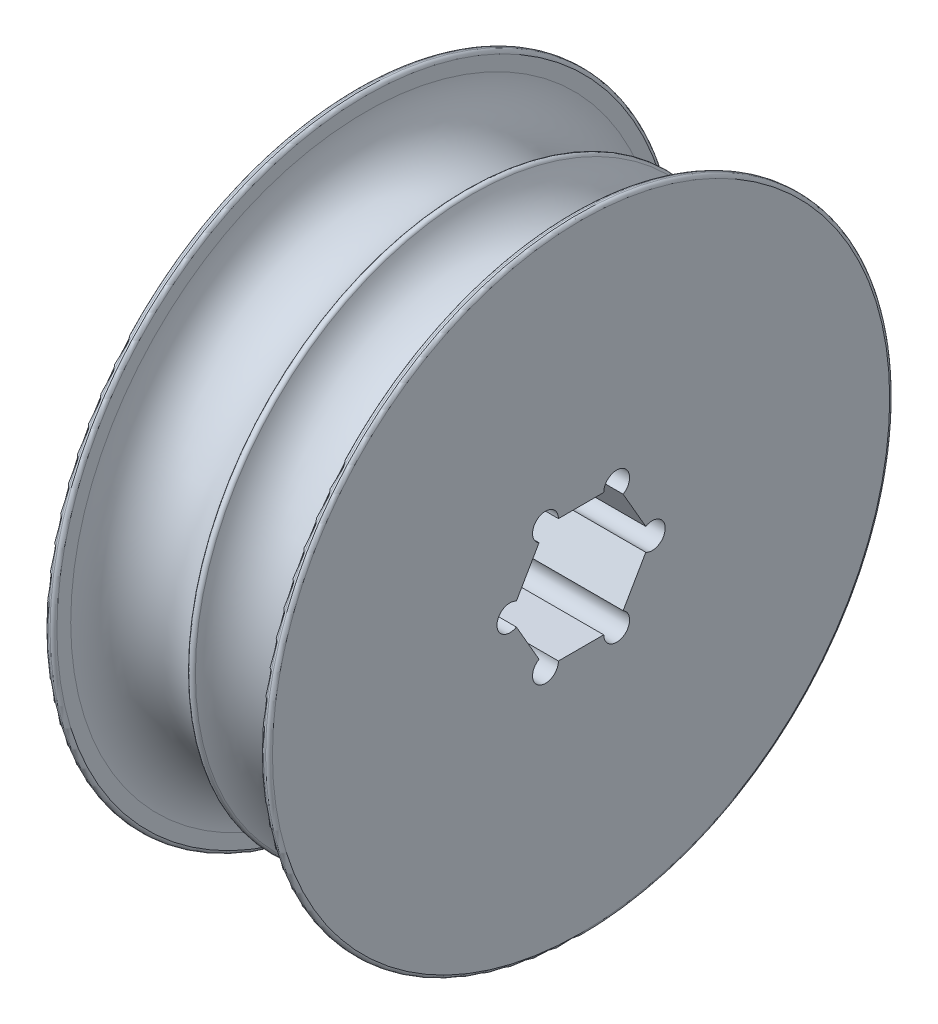
ISO-10303-21;
HEADER;
FILE_DESCRIPTION(('STEP AP214'),'2;1');
FILE_NAME('part.step','',(''),(''),'','','');
FILE_SCHEMA(('AUTOMOTIVE_DESIGN { 1 0 10303 214 1 1 1 1 }'));
ENDSEC;
DATA;
#1=APPLICATION_CONTEXT('core data for automotive mechanical design processes');
#2=APPLICATION_PROTOCOL_DEFINITION('international standard','automotive_design',2000,#1);
#3=PRODUCT_CONTEXT('',#1,'mechanical');
#4=PRODUCT('Part','Part','',(#3));
#5=PRODUCT_RELATED_PRODUCT_CATEGORY('part','',(#4));
#6=PRODUCT_DEFINITION_FORMATION('','',#4);
#7=PRODUCT_DEFINITION_CONTEXT('part definition',#1,'design');
#8=PRODUCT_DEFINITION('design','',#6,#7);
#9=PRODUCT_DEFINITION_SHAPE('','',#8);
#10=(LENGTH_UNIT() NAMED_UNIT(*) SI_UNIT(.MILLI.,.METRE.));
#11=(NAMED_UNIT(*) PLANE_ANGLE_UNIT() SI_UNIT($,.RADIAN.));
#12=(NAMED_UNIT(*) SI_UNIT($,.STERADIAN.) SOLID_ANGLE_UNIT());
#13=UNCERTAINTY_MEASURE_WITH_UNIT(LENGTH_MEASURE(1.E-05),#10,'distance_accuracy_value','');
#14=(GEOMETRIC_REPRESENTATION_CONTEXT(3) GLOBAL_UNCERTAINTY_ASSIGNED_CONTEXT((#13)) GLOBAL_UNIT_ASSIGNED_CONTEXT((#10,
#11,#12)) REPRESENTATION_CONTEXT('',''));
#15=CARTESIAN_POINT('',(0.,0.,0.));
#16=DIRECTION('',(0.,0.,1.));
#17=DIRECTION('',(1.,0.,0.));
#18=AXIS2_PLACEMENT_3D('',#15,#16,#17);
#19=CARTESIAN_POINT('',(0.,0.,0.));
#20=DIRECTION('',(-1.,0.,0.));
#21=DIRECTION('',(0.,0.,1.));
#22=AXIS2_PLACEMENT_3D('',#19,#20,#21);
#23=PLANE('',#22);
#24=CARTESIAN_POINT('',(0.,0.,0.));
#25=DIRECTION('',(-1.,0.,0.));
#26=DIRECTION('',(0.,0.,1.));
#27=AXIS2_PLACEMENT_3D('',#24,#25,#26);
#28=CIRCLE('',#27,17.9);
#29=CARTESIAN_POINT('',(0.,0.,17.9));
#30=VERTEX_POINT('',#29);
#31=EDGE_CURVE('E162',#30,#30,#28,.F.);
#32=ORIENTED_EDGE('',*,*,#31,.T.);
#33=EDGE_LOOP('',(#32));
#34=FACE_BOUND('',#33,.T.);
#35=DIRECTION('',(0.,-0.866025403784438,-0.500000000000001));
#36=VECTOR('',#35,1.);
#37=CARTESIAN_POINT('',(0.,-0.649519052838328,3.75305442470583));
#38=LINE('',#37,#36);
#39=CARTESIAN_POINT('',(0.,-2.92548094716167,2.43902721235291));
#40=VERTEX_POINT('',#39);
#41=CARTESIAN_POINT('',(0.,-0.649519052838329,3.75305442470583));
#42=VERTEX_POINT('',#41);
#43=EDGE_CURVE('E223',#40,#42,#38,.F.);
#44=ORIENTED_EDGE('',*,*,#43,.T.);
#45=CARTESIAN_POINT('',(0.,0.,4.12805442470582));
#46=DIRECTION('',(1.,0.,0.));
#47=DIRECTION('',(0.,0.,-1.));
#48=AXIS2_PLACEMENT_3D('',#45,#46,#47);
#49=CIRCLE('',#48,0.75);
#50=CARTESIAN_POINT('',(0.,0.64951905283833,3.75305442470582));
#51=VERTEX_POINT('',#50);
#52=EDGE_CURVE('E137',#51,#42,#49,.T.);
#53=ORIENTED_EDGE('',*,*,#52,.F.);
#54=DIRECTION('',(0.,-0.866025403784439,0.5));
#55=VECTOR('',#54,1.);
#56=CARTESIAN_POINT('',(0.,2.92548094716167,2.43902721235291));
#57=LINE('',#56,#55);
#58=CARTESIAN_POINT('',(0.,2.92548094716167,2.43902721235291));
#59=VERTEX_POINT('',#58);
#60=EDGE_CURVE('E122',#51,#59,#57,.F.);
#61=ORIENTED_EDGE('',*,*,#60,.T.);
#62=CARTESIAN_POINT('',(0.,3.575,2.06402721235291));
#63=DIRECTION('',(1.,0.,0.));
#64=DIRECTION('',(0.,0.,-1.));
#65=AXIS2_PLACEMENT_3D('',#62,#63,#64);
#66=CIRCLE('',#65,0.75);
#67=CARTESIAN_POINT('',(0.,3.575,1.31402721235291));
#68=VERTEX_POINT('',#67);
#69=EDGE_CURVE('E109',#68,#59,#66,.T.);
#70=ORIENTED_EDGE('',*,*,#69,.F.);
#71=DIRECTION('',(0.,0.,1.));
#72=VECTOR('',#71,1.);
#73=CARTESIAN_POINT('',(0.,3.575,0.));
#74=LINE('',#73,#72);
#75=CARTESIAN_POINT('',(0.,3.575,-1.31402721235292));
#76=VERTEX_POINT('',#75);
#77=EDGE_CURVE('E123',#68,#76,#74,.F.);
#78=ORIENTED_EDGE('',*,*,#77,.T.);
#79=CARTESIAN_POINT('',(0.,3.575,-2.06402721235292));
#80=DIRECTION('',(1.,0.,0.));
#81=DIRECTION('',(0.,0.,-1.));
#82=AXIS2_PLACEMENT_3D('',#79,#80,#81);
#83=CIRCLE('',#82,0.75);
#84=CARTESIAN_POINT('',(0.,2.92548094716167,-2.43902721235291));
#85=VERTEX_POINT('',#84);
#86=EDGE_CURVE('E286',#85,#76,#83,.T.);
#87=ORIENTED_EDGE('',*,*,#86,.F.);
#88=DIRECTION('',(0.,0.866025403784438,0.500000000000001));
#89=VECTOR('',#88,1.);
#90=CARTESIAN_POINT('',(0.,0.649519052838327,-3.75305442470583));
#91=LINE('',#90,#89);
#92=CARTESIAN_POINT('',(0.,0.649519052838327,-3.75305442470583));
#93=VERTEX_POINT('',#92);
#94=EDGE_CURVE('E282',#85,#93,#91,.F.);
#95=ORIENTED_EDGE('',*,*,#94,.T.);
#96=CARTESIAN_POINT('',(0.,0.,-4.12805442470583));
#97=DIRECTION('',(1.,0.,0.));
#98=DIRECTION('',(0.,0.,-1.));
#99=AXIS2_PLACEMENT_3D('',#96,#97,#98);
#100=CIRCLE('',#99,0.75);
#101=CARTESIAN_POINT('',(0.,-0.649519052838329,-3.75305442470582));
#102=VERTEX_POINT('',#101);
#103=EDGE_CURVE('E279',#102,#93,#100,.T.);
#104=ORIENTED_EDGE('',*,*,#103,.F.);
#105=DIRECTION('',(0.,0.866025403784439,-0.5));
#106=VECTOR('',#105,1.);
#107=CARTESIAN_POINT('',(0.,-2.92548094716167,-2.43902721235291));
#108=LINE('',#107,#106);
#109=CARTESIAN_POINT('',(0.,-2.92548094716167,-2.43902721235291));
#110=VERTEX_POINT('',#109);
#111=EDGE_CURVE('E275',#102,#110,#108,.F.);
#112=ORIENTED_EDGE('',*,*,#111,.T.);
#113=CARTESIAN_POINT('',(0.,-3.575,-2.06402721235291));
#114=DIRECTION('',(1.,0.,0.));
#115=DIRECTION('',(0.,0.,-1.));
#116=AXIS2_PLACEMENT_3D('',#113,#114,#115);
#117=CIRCLE('',#116,0.75);
#118=CARTESIAN_POINT('',(0.,-3.575,-1.31402721235291));
#119=VERTEX_POINT('',#118);
#120=EDGE_CURVE('E272',#119,#110,#117,.T.);
#121=ORIENTED_EDGE('',*,*,#120,.F.);
#122=DIRECTION('',(0.,0.,1.));
#123=VECTOR('',#122,1.);
#124=CARTESIAN_POINT('',(0.,-3.575,0.));
#125=LINE('',#124,#123);
#126=CARTESIAN_POINT('',(0.,-3.575,1.31402721235291));
#127=VERTEX_POINT('',#126);
#128=EDGE_CURVE('E268',#119,#127,#125,.T.);
#129=ORIENTED_EDGE('',*,*,#128,.T.);
#130=CARTESIAN_POINT('',(0.,-3.575,2.06402721235292));
#131=DIRECTION('',(1.,0.,0.));
#132=DIRECTION('',(0.,0.,-1.));
#133=AXIS2_PLACEMENT_3D('',#130,#131,#132);
#134=CIRCLE('',#133,0.75);
#135=EDGE_CURVE('E265',#40,#127,#134,.T.);
#136=ORIENTED_EDGE('',*,*,#135,.F.);
#137=EDGE_LOOP('',(#44,#53,#61,#70,#78,#87,#95,#104,#112,#121,#129,#136));
#138=FACE_BOUND('',#137,.T.);
#139=ADVANCED_FACE('F45',(#34,#138),#23,.F.);
#140=CARTESIAN_POINT('',(-13.,0.,0.));
#141=DIRECTION('',(-1.,0.,0.));
#142=DIRECTION('',(0.,0.,1.));
#143=AXIS2_PLACEMENT_3D('',#140,#141,#142);
#144=CYLINDRICAL_SURFACE('',#143,18.1);
#145=CARTESIAN_POINT('',(-0.200000000000004,0.,0.));
#146=DIRECTION('',(-1.,0.,0.));
#147=DIRECTION('',(0.,0.,1.));
#148=AXIS2_PLACEMENT_3D('',#145,#146,#147);
#149=CIRCLE('',#148,18.1);
#150=CARTESIAN_POINT('',(-0.200000000000002,0.,18.1));
#151=VERTEX_POINT('',#150);
#152=EDGE_CURVE('E158',#151,#151,#149,.T.);
#153=ORIENTED_EDGE('',*,*,#152,.T.);
#154=EDGE_LOOP('',(#153));
#155=FACE_BOUND('',#154,.T.);
#156=CARTESIAN_POINT('',(-0.300000000000003,0.,0.));
#157=DIRECTION('',(1.,0.,0.));
#158=DIRECTION('',(0.,0.,-1.));
#159=AXIS2_PLACEMENT_3D('',#156,#157,#158);
#160=CIRCLE('',#159,18.1);
#161=CARTESIAN_POINT('',(-0.300000000000006,0.,-18.1));
#162=VERTEX_POINT('',#161);
#163=EDGE_CURVE('E154',#162,#162,#160,.T.);
#164=ORIENTED_EDGE('',*,*,#163,.T.);
#165=EDGE_LOOP('',(#164));
#166=FACE_BOUND('',#165,.T.);
#167=ADVANCED_FACE('F380',(#155,#166),#144,.T.);
#168=CARTESIAN_POINT('',(-0.500000000000004,0.,-18.1));
#169=DIRECTION('',(1.,0.,0.));
#170=DIRECTION('',(0.,0.,-1.));
#171=AXIS2_PLACEMENT_3D('',#168,#169,#170);
#172=PLANE('',#171);
#173=CARTESIAN_POINT('',(-0.500000000000002,0.,0.));
#174=DIRECTION('',(1.,0.,0.));
#175=DIRECTION('',(0.,0.,-1.));
#176=AXIS2_PLACEMENT_3D('',#173,#174,#175);
#177=CIRCLE('',#176,17.9);
#178=CARTESIAN_POINT('',(-0.500000000000004,0.,-17.9));
#179=VERTEX_POINT('',#178);
#180=EDGE_CURVE('E166',#179,#179,#177,.F.);
#181=ORIENTED_EDGE('',*,*,#180,.T.);
#182=EDGE_LOOP('',(#181));
#183=FACE_BOUND('',#182,.T.);
#184=CARTESIAN_POINT('',(-0.500000000000002,0.,0.));
#185=DIRECTION('',(-1.,0.,0.));
#186=DIRECTION('',(0.,0.,1.));
#187=AXIS2_PLACEMENT_3D('',#184,#185,#186);
#188=CIRCLE('',#187,17.1);
#189=CARTESIAN_POINT('',(-0.5,0.,17.1));
#190=VERTEX_POINT('',#189);
#191=EDGE_CURVE('E150',#190,#190,#188,.T.);
#192=ORIENTED_EDGE('',*,*,#191,.F.);
#193=EDGE_LOOP('',(#192));
#194=FACE_BOUND('',#193,.T.);
#195=ADVANCED_FACE('F387',(#183,#194),#172,.F.);
#196=CARTESIAN_POINT('',(-3.5,0.,0.));
#197=DIRECTION('',(-1.,0.,0.));
#198=DIRECTION('',(0.,0.,1.));
#199=AXIS2_PLACEMENT_3D('',#196,#197,#198);
#200=TOROIDAL_SURFACE('',#199,17.1,3.);
#201=CARTESIAN_POINT('',(-6.31250000000001,0.,0.));
#202=DIRECTION('',(1.,0.,0.));
#203=DIRECTION('',(0.,0.,-1.));
#204=AXIS2_PLACEMENT_3D('',#201,#202,#203);
#205=CIRCLE('',#204,16.0560441819694);
#206=CARTESIAN_POINT('',(-6.31250000000001,0.,-16.0560441819694));
#207=VERTEX_POINT('',#206);
#208=EDGE_CURVE('E149',#207,#207,#205,.T.);
#209=ORIENTED_EDGE('',*,*,#208,.T.);
#210=EDGE_LOOP('',(#209));
#211=FACE_BOUND('',#210,.T.);
#212=ORIENTED_EDGE('',*,*,#191,.T.);
#213=EDGE_LOOP('',(#212));
#214=FACE_BOUND('',#213,.T.);
#215=ADVANCED_FACE('F410',(#211,#214),#200,.F.);
#216=CARTESIAN_POINT('',(-9.5,0.,0.));
#217=DIRECTION('',(-1.,0.,0.));
#218=DIRECTION('',(0.,0.,1.));
#219=AXIS2_PLACEMENT_3D('',#216,#217,#218);
#220=TOROIDAL_SURFACE('',#219,17.1,3.);
#221=CARTESIAN_POINT('',(-6.68750000000012,0.,0.));
#222=DIRECTION('',(-1.,0.,0.));
#223=DIRECTION('',(0.,0.,1.));
#224=AXIS2_PLACEMENT_3D('',#221,#222,#223);
#225=CIRCLE('',#224,16.0560441819694);
#226=CARTESIAN_POINT('',(-6.68750000000012,0.,16.0560441819694));
#227=VERTEX_POINT('',#226);
#228=EDGE_CURVE('E145',#227,#227,#225,.T.);
#229=ORIENTED_EDGE('',*,*,#228,.T.);
#230=EDGE_LOOP('',(#229));
#231=FACE_BOUND('',#230,.T.);
#232=CARTESIAN_POINT('',(-12.5,0.,0.));
#233=DIRECTION('',(-1.,0.,0.));
#234=DIRECTION('',(0.,0.,1.));
#235=AXIS2_PLACEMENT_3D('',#232,#233,#234);
#236=CIRCLE('',#235,17.1);
#237=CARTESIAN_POINT('',(-12.5,0.,17.1));
#238=VERTEX_POINT('',#237);
#239=EDGE_CURVE('E141',#238,#238,#236,.T.);
#240=ORIENTED_EDGE('',*,*,#239,.F.);
#241=EDGE_LOOP('',(#240));
#242=FACE_BOUND('',#241,.T.);
#243=ADVANCED_FACE('F414',(#231,#242),#220,.F.);
#244=CARTESIAN_POINT('',(-12.5,0.,-18.1));
#245=DIRECTION('',(-1.,0.,0.));
#246=DIRECTION('',(0.,0.,1.));
#247=AXIS2_PLACEMENT_3D('',#244,#245,#246);
#248=PLANE('',#247);
#249=CARTESIAN_POINT('',(-12.5,0.,0.));
#250=DIRECTION('',(-1.,0.,0.));
#251=DIRECTION('',(0.,0.,1.));
#252=AXIS2_PLACEMENT_3D('',#249,#250,#251);
#253=CIRCLE('',#252,17.9);
#254=CARTESIAN_POINT('',(-12.5,0.,17.9));
#255=VERTEX_POINT('',#254);
#256=EDGE_CURVE('E54',#255,#255,#253,.F.);
#257=ORIENTED_EDGE('',*,*,#256,.T.);
#258=EDGE_LOOP('',(#257));
#259=FACE_BOUND('',#258,.T.);
#260=ORIENTED_EDGE('',*,*,#239,.T.);
#261=EDGE_LOOP('',(#260));
#262=FACE_BOUND('',#261,.T.);
#263=ADVANCED_FACE('F181',(#259,#262),#248,.F.);
#264=CARTESIAN_POINT('',(-13.,0.,0.));
#265=DIRECTION('',(-1.,0.,0.));
#266=DIRECTION('',(0.,0.,1.));
#267=AXIS2_PLACEMENT_3D('',#264,#265,#266);
#268=CYLINDRICAL_SURFACE('',#267,18.1);
#269=CARTESIAN_POINT('',(-12.7,0.,0.));
#270=DIRECTION('',(-1.,0.,0.));
#271=DIRECTION('',(0.,0.,1.));
#272=AXIS2_PLACEMENT_3D('',#269,#270,#271);
#273=CIRCLE('',#272,18.1);
#274=CARTESIAN_POINT('',(-12.7,0.,18.1));
#275=VERTEX_POINT('',#274);
#276=EDGE_CURVE('E174',#275,#275,#273,.T.);
#277=ORIENTED_EDGE('',*,*,#276,.T.);
#278=EDGE_LOOP('',(#277));
#279=FACE_BOUND('',#278,.T.);
#280=CARTESIAN_POINT('',(-12.8,0.,0.));
#281=DIRECTION('',(1.,0.,0.));
#282=DIRECTION('',(0.,0.,-1.));
#283=AXIS2_PLACEMENT_3D('',#280,#281,#282);
#284=CIRCLE('',#283,18.1);
#285=CARTESIAN_POINT('',(-12.8,0.,-18.1));
#286=VERTEX_POINT('',#285);
#287=EDGE_CURVE('E170',#286,#286,#284,.T.);
#288=ORIENTED_EDGE('',*,*,#287,.T.);
#289=EDGE_LOOP('',(#288));
#290=FACE_BOUND('',#289,.T.);
#291=ADVANCED_FACE('F190',(#279,#290),#268,.T.);
#292=CARTESIAN_POINT('',(-13.,0.,0.));
#293=DIRECTION('',(1.,0.,0.));
#294=DIRECTION('',(0.,0.,-1.));
#295=AXIS2_PLACEMENT_3D('',#292,#293,#294);
#296=PLANE('',#295);
#297=CARTESIAN_POINT('',(-13.,0.,0.));
#298=DIRECTION('',(1.,0.,0.));
#299=DIRECTION('',(0.,0.,-1.));
#300=AXIS2_PLACEMENT_3D('',#297,#298,#299);
#301=CIRCLE('',#300,17.9);
#302=CARTESIAN_POINT('',(-13.,0.,-17.9));
#303=VERTEX_POINT('',#302);
#304=EDGE_CURVE('E11',#303,#303,#301,.F.);
#305=ORIENTED_EDGE('',*,*,#304,.T.);
#306=EDGE_LOOP('',(#305));
#307=FACE_BOUND('',#306,.T.);
#308=DIRECTION('',(0.,0.866025403784439,-0.5));
#309=VECTOR('',#308,1.);
#310=CARTESIAN_POINT('',(-13.,0.64951905283833,3.75305442470583));
#311=LINE('',#310,#309);
#312=CARTESIAN_POINT('',(-13.,0.64951905283833,3.75305442470583));
#313=VERTEX_POINT('',#312);
#314=CARTESIAN_POINT('',(-13.,2.92548094716167,2.43902721235291));
#315=VERTEX_POINT('',#314);
#316=EDGE_CURVE('E131',#313,#315,#311,.T.);
#317=ORIENTED_EDGE('',*,*,#316,.F.);
#318=CARTESIAN_POINT('',(-13.,0.,4.12805442470583));
#319=DIRECTION('',(1.,0.,0.));
#320=DIRECTION('',(0.,0.,-1.));
#321=AXIS2_PLACEMENT_3D('',#318,#319,#320);
#322=CIRCLE('',#321,0.75);
#323=CARTESIAN_POINT('',(-13.,-0.649519052838328,3.75305442470583));
#324=VERTEX_POINT('',#323);
#325=EDGE_CURVE('E209',#313,#324,#322,.T.);
#326=ORIENTED_EDGE('',*,*,#325,.T.);
#327=DIRECTION('',(0.,0.866025403784438,0.500000000000001));
#328=VECTOR('',#327,1.);
#329=CARTESIAN_POINT('',(-13.,-2.92548094716167,2.43902721235291));
#330=LINE('',#329,#328);
#331=CARTESIAN_POINT('',(-13.,-2.92548094716167,2.43902721235291));
#332=VERTEX_POINT('',#331);
#333=EDGE_CURVE('E330',#332,#324,#330,.T.);
#334=ORIENTED_EDGE('',*,*,#333,.F.);
#335=CARTESIAN_POINT('',(-13.,-3.575,2.06402721235292));
#336=DIRECTION('',(1.,0.,0.));
#337=DIRECTION('',(0.,0.,-1.));
#338=AXIS2_PLACEMENT_3D('',#335,#336,#337);
#339=CIRCLE('',#338,0.75);
#340=CARTESIAN_POINT('',(-13.,-3.575,1.31402721235292));
#341=VERTEX_POINT('',#340);
#342=EDGE_CURVE('E70',#332,#341,#339,.T.);
#343=ORIENTED_EDGE('',*,*,#342,.T.);
#344=DIRECTION('',(0.,0.,1.));
#345=VECTOR('',#344,1.);
#346=CARTESIAN_POINT('',(-13.,-3.575,-1.31402721235291));
#347=LINE('',#346,#345);
#348=CARTESIAN_POINT('',(-13.,-3.575,-1.31402721235291));
#349=VERTEX_POINT('',#348);
#350=EDGE_CURVE('E324',#349,#341,#347,.T.);
#351=ORIENTED_EDGE('',*,*,#350,.F.);
#352=CARTESIAN_POINT('',(-13.,-3.575,-2.06402721235291));
#353=DIRECTION('',(1.,0.,0.));
#354=DIRECTION('',(0.,0.,-1.));
#355=AXIS2_PLACEMENT_3D('',#352,#353,#354);
#356=CIRCLE('',#355,0.75);
#357=CARTESIAN_POINT('',(-13.,-2.92548094716167,-2.43902721235291));
#358=VERTEX_POINT('',#357);
#359=EDGE_CURVE('E320',#349,#358,#356,.T.);
#360=ORIENTED_EDGE('',*,*,#359,.T.);
#361=DIRECTION('',(0.,-0.866025403784439,0.5));
#362=VECTOR('',#361,1.);
#363=CARTESIAN_POINT('',(-13.,-0.64951905283833,-3.75305442470582));
#364=LINE('',#363,#362);
#365=CARTESIAN_POINT('',(-13.,-0.64951905283833,-3.75305442470582));
#366=VERTEX_POINT('',#365);
#367=EDGE_CURVE('E316',#366,#358,#364,.T.);
#368=ORIENTED_EDGE('',*,*,#367,.F.);
#369=CARTESIAN_POINT('',(-13.,0.,-4.12805442470582));
#370=DIRECTION('',(1.,0.,0.));
#371=DIRECTION('',(0.,0.,-1.));
#372=AXIS2_PLACEMENT_3D('',#369,#370,#371);
#373=CIRCLE('',#372,0.75);
#374=CARTESIAN_POINT('',(-13.,0.649519052838327,-3.75305442470583));
#375=VERTEX_POINT('',#374);
#376=EDGE_CURVE('E311',#366,#375,#373,.T.);
#377=ORIENTED_EDGE('',*,*,#376,.T.);
#378=DIRECTION('',(0.,-0.866025403784438,-0.500000000000001));
#379=VECTOR('',#378,1.);
#380=CARTESIAN_POINT('',(-13.,2.92548094716167,-2.43902721235291));
#381=LINE('',#380,#379);
#382=CARTESIAN_POINT('',(-13.,2.92548094716167,-2.43902721235291));
#383=VERTEX_POINT('',#382);
#384=EDGE_CURVE('E306',#383,#375,#381,.T.);
#385=ORIENTED_EDGE('',*,*,#384,.F.);
#386=CARTESIAN_POINT('',(-13.,3.575,-2.06402721235291));
#387=DIRECTION('',(1.,0.,0.));
#388=DIRECTION('',(0.,0.,-1.));
#389=AXIS2_PLACEMENT_3D('',#386,#387,#388);
#390=CIRCLE('',#389,0.75);
#391=CARTESIAN_POINT('',(-13.,3.575,-1.31402721235291));
#392=VERTEX_POINT('',#391);
#393=EDGE_CURVE('E301',#383,#392,#390,.T.);
#394=ORIENTED_EDGE('',*,*,#393,.T.);
#395=DIRECTION('',(0.,0.,-1.));
#396=VECTOR('',#395,1.);
#397=CARTESIAN_POINT('',(-13.,3.575,1.31402721235291));
#398=LINE('',#397,#396);
#399=CARTESIAN_POINT('',(-13.,3.575,1.31402721235291));
#400=VERTEX_POINT('',#399);
#401=EDGE_CURVE('E218',#400,#392,#398,.T.);
#402=ORIENTED_EDGE('',*,*,#401,.F.);
#403=CARTESIAN_POINT('',(-13.,3.575,2.06402721235291));
#404=DIRECTION('',(1.,0.,0.));
#405=DIRECTION('',(0.,0.,-1.));
#406=AXIS2_PLACEMENT_3D('',#403,#404,#405);
#407=CIRCLE('',#406,0.75);
#408=EDGE_CURVE('E211',#400,#315,#407,.T.);
#409=ORIENTED_EDGE('',*,*,#408,.T.);
#410=EDGE_LOOP('',(#317,#326,#334,#343,#351,#360,#368,#377,#385,#394,#402,#409));
#411=FACE_BOUND('',#410,.T.);
#412=ADVANCED_FACE('F193',(#307,#411),#296,.F.);
#413=CARTESIAN_POINT('',(-13.,0.,4.12805442470583));
#414=DIRECTION('',(1.,0.,0.));
#415=DIRECTION('',(0.,0.,-1.));
#416=AXIS2_PLACEMENT_3D('',#413,#414,#415);
#417=CYLINDRICAL_SURFACE('',#416,0.75);
#418=DIRECTION('',(1.,0.,0.));
#419=VECTOR('',#418,1.);
#420=CARTESIAN_POINT('',(-13.,-0.649519052838328,3.75305442470583));
#421=LINE('',#420,#419);
#422=EDGE_CURVE('E61',#324,#42,#421,.T.);
#423=ORIENTED_EDGE('',*,*,#422,.F.);
#424=ORIENTED_EDGE('',*,*,#325,.F.);
#425=DIRECTION('',(1.,0.,0.));
#426=VECTOR('',#425,1.);
#427=CARTESIAN_POINT('',(-13.,0.64951905283833,3.75305442470583));
#428=LINE('',#427,#426);
#429=EDGE_CURVE('E133',#313,#51,#428,.T.);
#430=ORIENTED_EDGE('',*,*,#429,.T.);
#431=ORIENTED_EDGE('',*,*,#52,.T.);
#432=EDGE_LOOP('',(#423,#424,#430,#431));
#433=FACE_BOUND('',#432,.T.);
#434=ADVANCED_FACE('F203',(#433),#417,.F.);
#435=CARTESIAN_POINT('',(-13.,0.64951905283833,3.75305442470583));
#436=DIRECTION('',(0.,-0.5,-0.866025403784439));
#437=DIRECTION('',(0.,0.866025403784439,-0.5));
#438=AXIS2_PLACEMENT_3D('',#435,#436,#437);
#439=PLANE('',#438);
#440=ORIENTED_EDGE('',*,*,#60,.F.);
#441=ORIENTED_EDGE('',*,*,#429,.F.);
#442=ORIENTED_EDGE('',*,*,#316,.T.);
#443=DIRECTION('',(1.,0.,0.));
#444=VECTOR('',#443,1.);
#445=CARTESIAN_POINT('',(-13.,2.92548094716167,2.43902721235291));
#446=LINE('',#445,#444);
#447=EDGE_CURVE('E114',#315,#59,#446,.T.);
#448=ORIENTED_EDGE('',*,*,#447,.T.);
#449=EDGE_LOOP('',(#440,#441,#442,#448));
#450=FACE_BOUND('',#449,.T.);
#451=ADVANCED_FACE('F127',(#450),#439,.T.);
#452=CARTESIAN_POINT('',(-13.,3.575,2.06402721235291));
#453=DIRECTION('',(1.,0.,0.));
#454=DIRECTION('',(0.,0.,-1.));
#455=AXIS2_PLACEMENT_3D('',#452,#453,#454);
#456=CYLINDRICAL_SURFACE('',#455,0.75);
#457=ORIENTED_EDGE('',*,*,#447,.F.);
#458=ORIENTED_EDGE('',*,*,#408,.F.);
#459=DIRECTION('',(1.,0.,0.));
#460=VECTOR('',#459,1.);
#461=CARTESIAN_POINT('',(-13.,3.575,1.31402721235291));
#462=LINE('',#461,#460);
#463=EDGE_CURVE('E117',#400,#68,#462,.T.);
#464=ORIENTED_EDGE('',*,*,#463,.T.);
#465=ORIENTED_EDGE('',*,*,#69,.T.);
#466=EDGE_LOOP('',(#457,#458,#464,#465));
#467=FACE_BOUND('',#466,.T.);
#468=ADVANCED_FACE('F111',(#467),#456,.F.);
#469=CARTESIAN_POINT('',(-13.,3.575,1.31402721235291));
#470=DIRECTION('',(0.,-1.,0.));
#471=DIRECTION('',(0.,0.,-1.));
#472=AXIS2_PLACEMENT_3D('',#469,#470,#471);
#473=PLANE('',#472);
#474=ORIENTED_EDGE('',*,*,#77,.F.);
#475=ORIENTED_EDGE('',*,*,#463,.F.);
#476=ORIENTED_EDGE('',*,*,#401,.T.);
#477=DIRECTION('',(1.,0.,0.));
#478=VECTOR('',#477,1.);
#479=CARTESIAN_POINT('',(-13.,3.575,-1.31402721235291));
#480=LINE('',#479,#478);
#481=EDGE_CURVE('E226',#392,#76,#480,.T.);
#482=ORIENTED_EDGE('',*,*,#481,.T.);
#483=EDGE_LOOP('',(#474,#475,#476,#482));
#484=FACE_BOUND('',#483,.T.);
#485=ADVANCED_FACE('F291',(#484),#473,.T.);
#486=CARTESIAN_POINT('',(-13.,3.575,-2.06402721235291));
#487=DIRECTION('',(1.,0.,0.));
#488=DIRECTION('',(0.,0.,-1.));
#489=AXIS2_PLACEMENT_3D('',#486,#487,#488);
#490=CYLINDRICAL_SURFACE('',#489,0.75);
#491=ORIENTED_EDGE('',*,*,#481,.F.);
#492=ORIENTED_EDGE('',*,*,#393,.F.);
#493=DIRECTION('',(1.,0.,0.));
#494=VECTOR('',#493,1.);
#495=CARTESIAN_POINT('',(-13.,2.92548094716167,-2.43902721235291));
#496=LINE('',#495,#494);
#497=EDGE_CURVE('E231',#383,#85,#496,.T.);
#498=ORIENTED_EDGE('',*,*,#497,.T.);
#499=ORIENTED_EDGE('',*,*,#86,.T.);
#500=EDGE_LOOP('',(#491,#492,#498,#499));
#501=FACE_BOUND('',#500,.T.);
#502=ADVANCED_FACE('F299',(#501),#490,.F.);
#503=CARTESIAN_POINT('',(-13.,2.92548094716167,-2.43902721235291));
#504=DIRECTION('',(0.,-0.500000000000001,0.866025403784438));
#505=DIRECTION('',(0.,-0.866025403784438,-0.500000000000001));
#506=AXIS2_PLACEMENT_3D('',#503,#504,#505);
#507=PLANE('',#506);
#508=ORIENTED_EDGE('',*,*,#94,.F.);
#509=ORIENTED_EDGE('',*,*,#497,.F.);
#510=ORIENTED_EDGE('',*,*,#384,.T.);
#511=DIRECTION('',(1.,0.,0.));
#512=VECTOR('',#511,1.);
#513=CARTESIAN_POINT('',(-13.,0.649519052838327,-3.75305442470583));
#514=LINE('',#513,#512);
#515=EDGE_CURVE('E235',#375,#93,#514,.T.);
#516=ORIENTED_EDGE('',*,*,#515,.T.);
#517=EDGE_LOOP('',(#508,#509,#510,#516));
#518=FACE_BOUND('',#517,.T.);
#519=ADVANCED_FACE('F367',(#518),#507,.T.);
#520=CARTESIAN_POINT('',(-13.,0.,-4.12805442470582));
#521=DIRECTION('',(1.,0.,0.));
#522=DIRECTION('',(0.,0.,-1.));
#523=AXIS2_PLACEMENT_3D('',#520,#521,#522);
#524=CYLINDRICAL_SURFACE('',#523,0.75);
#525=ORIENTED_EDGE('',*,*,#515,.F.);
#526=ORIENTED_EDGE('',*,*,#376,.F.);
#527=DIRECTION('',(1.,0.,0.));
#528=VECTOR('',#527,1.);
#529=CARTESIAN_POINT('',(-13.,-0.64951905283833,-3.75305442470582));
#530=LINE('',#529,#528);
#531=EDGE_CURVE('E239',#366,#102,#530,.T.);
#532=ORIENTED_EDGE('',*,*,#531,.T.);
#533=ORIENTED_EDGE('',*,*,#103,.T.);
#534=EDGE_LOOP('',(#525,#526,#532,#533));
#535=FACE_BOUND('',#534,.T.);
#536=ADVANCED_FACE('F370',(#535),#524,.F.);
#537=CARTESIAN_POINT('',(-13.,-0.64951905283833,-3.75305442470582));
#538=DIRECTION('',(0.,0.5,0.866025403784439));
#539=DIRECTION('',(0.,-0.866025403784439,0.5));
#540=AXIS2_PLACEMENT_3D('',#537,#538,#539);
#541=PLANE('',#540);
#542=ORIENTED_EDGE('',*,*,#111,.F.);
#543=ORIENTED_EDGE('',*,*,#531,.F.);
#544=ORIENTED_EDGE('',*,*,#367,.T.);
#545=DIRECTION('',(1.,0.,0.));
#546=VECTOR('',#545,1.);
#547=CARTESIAN_POINT('',(-13.,-2.92548094716167,-2.43902721235291));
#548=LINE('',#547,#546);
#549=EDGE_CURVE('E243',#358,#110,#548,.T.);
#550=ORIENTED_EDGE('',*,*,#549,.T.);
#551=EDGE_LOOP('',(#542,#543,#544,#550));
#552=FACE_BOUND('',#551,.T.);
#553=ADVANCED_FACE('F352',(#552),#541,.T.);
#554=CARTESIAN_POINT('',(-13.,-3.575,-2.06402721235291));
#555=DIRECTION('',(1.,0.,0.));
#556=DIRECTION('',(0.,0.,-1.));
#557=AXIS2_PLACEMENT_3D('',#554,#555,#556);
#558=CYLINDRICAL_SURFACE('',#557,0.75);
#559=ORIENTED_EDGE('',*,*,#549,.F.);
#560=ORIENTED_EDGE('',*,*,#359,.F.);
#561=DIRECTION('',(1.,0.,0.));
#562=VECTOR('',#561,1.);
#563=CARTESIAN_POINT('',(-13.,-3.575,-1.31402721235291));
#564=LINE('',#563,#562);
#565=EDGE_CURVE('E247',#349,#119,#564,.T.);
#566=ORIENTED_EDGE('',*,*,#565,.T.);
#567=ORIENTED_EDGE('',*,*,#120,.T.);
#568=EDGE_LOOP('',(#559,#560,#566,#567));
#569=FACE_BOUND('',#568,.T.);
#570=ADVANCED_FACE('F348',(#569),#558,.F.);
#571=CARTESIAN_POINT('',(-13.,-3.575,-1.31402721235291));
#572=DIRECTION('',(0.,1.,0.));
#573=DIRECTION('',(0.,0.,1.));
#574=AXIS2_PLACEMENT_3D('',#571,#572,#573);
#575=PLANE('',#574);
#576=ORIENTED_EDGE('',*,*,#128,.F.);
#577=ORIENTED_EDGE('',*,*,#565,.F.);
#578=ORIENTED_EDGE('',*,*,#350,.T.);
#579=DIRECTION('',(1.,0.,0.));
#580=VECTOR('',#579,1.);
#581=CARTESIAN_POINT('',(-13.,-3.575,1.31402721235292));
#582=LINE('',#581,#580);
#583=EDGE_CURVE('E251',#341,#127,#582,.T.);
#584=ORIENTED_EDGE('',*,*,#583,.T.);
#585=EDGE_LOOP('',(#576,#577,#578,#584));
#586=FACE_BOUND('',#585,.T.);
#587=ADVANCED_FACE('F341',(#586),#575,.T.);
#588=CARTESIAN_POINT('',(-13.,-3.575,2.06402721235292));
#589=DIRECTION('',(1.,0.,0.));
#590=DIRECTION('',(0.,0.,-1.));
#591=AXIS2_PLACEMENT_3D('',#588,#589,#590);
#592=CYLINDRICAL_SURFACE('',#591,0.75);
#593=ORIENTED_EDGE('',*,*,#583,.F.);
#594=ORIENTED_EDGE('',*,*,#342,.F.);
#595=DIRECTION('',(1.,0.,0.));
#596=VECTOR('',#595,1.);
#597=CARTESIAN_POINT('',(-13.,-2.92548094716167,2.43902721235291));
#598=LINE('',#597,#596);
#599=EDGE_CURVE('E216',#332,#40,#598,.T.);
#600=ORIENTED_EDGE('',*,*,#599,.T.);
#601=ORIENTED_EDGE('',*,*,#135,.T.);
#602=EDGE_LOOP('',(#593,#594,#600,#601));
#603=FACE_BOUND('',#602,.T.);
#604=ADVANCED_FACE('F339',(#603),#592,.F.);
#605=CARTESIAN_POINT('',(-13.,-2.92548094716167,2.43902721235291));
#606=DIRECTION('',(0.,0.500000000000001,-0.866025403784438));
#607=DIRECTION('',(0.,0.866025403784438,0.500000000000001));
#608=AXIS2_PLACEMENT_3D('',#605,#606,#607);
#609=PLANE('',#608);
#610=ORIENTED_EDGE('',*,*,#43,.F.);
#611=ORIENTED_EDGE('',*,*,#599,.F.);
#612=ORIENTED_EDGE('',*,*,#333,.T.);
#613=ORIENTED_EDGE('',*,*,#422,.T.);
#614=EDGE_LOOP('',(#610,#611,#612,#613));
#615=FACE_BOUND('',#614,.T.);
#616=ADVANCED_FACE('F334',(#615),#609,.T.);
#617=CARTESIAN_POINT('',(-6.5,0.,0.));
#618=DIRECTION('',(1.,0.,0.));
#619=DIRECTION('',(0.,0.,-1.));
#620=AXIS2_PLACEMENT_3D('',#617,#618,#619);
#621=TOROIDAL_SURFACE('',#620,15.986447127434,0.2);
#622=ORIENTED_EDGE('',*,*,#208,.F.);
#623=EDGE_LOOP('',(#622));
#624=FACE_BOUND('',#623,.T.);
#625=ORIENTED_EDGE('',*,*,#228,.F.);
#626=EDGE_LOOP('',(#625));
#627=FACE_BOUND('',#626,.T.);
#628=ADVANCED_FACE('F392',(#624,#627),#621,.T.);
#629=CARTESIAN_POINT('',(-0.200000000000004,0.,0.));
#630=DIRECTION('',(-1.,0.,0.));
#631=DIRECTION('',(0.,0.,1.));
#632=AXIS2_PLACEMENT_3D('',#629,#630,#631);
#633=TOROIDAL_SURFACE('',#632,17.9,0.2);
#634=ORIENTED_EDGE('',*,*,#31,.F.);
#635=EDGE_LOOP('',(#634));
#636=FACE_BOUND('',#635,.T.);
#637=ORIENTED_EDGE('',*,*,#152,.F.);
#638=EDGE_LOOP('',(#637));
#639=FACE_BOUND('',#638,.T.);
#640=ADVANCED_FACE('F395',(#636,#639),#633,.T.);
#641=CARTESIAN_POINT('',(-0.300000000000003,0.,0.));
#642=DIRECTION('',(1.,0.,0.));
#643=DIRECTION('',(0.,0.,-1.));
#644=AXIS2_PLACEMENT_3D('',#641,#642,#643);
#645=TOROIDAL_SURFACE('',#644,17.9,0.2);
#646=ORIENTED_EDGE('',*,*,#163,.F.);
#647=EDGE_LOOP('',(#646));
#648=FACE_BOUND('',#647,.T.);
#649=ORIENTED_EDGE('',*,*,#180,.F.);
#650=EDGE_LOOP('',(#649));
#651=FACE_BOUND('',#650,.T.);
#652=ADVANCED_FACE('F187',(#648,#651),#645,.T.);
#653=CARTESIAN_POINT('',(-12.7,0.,0.));
#654=DIRECTION('',(-1.,0.,0.));
#655=DIRECTION('',(0.,0.,1.));
#656=AXIS2_PLACEMENT_3D('',#653,#654,#655);
#657=TOROIDAL_SURFACE('',#656,17.9,0.2);
#658=ORIENTED_EDGE('',*,*,#256,.F.);
#659=EDGE_LOOP('',(#658));
#660=FACE_BOUND('',#659,.T.);
#661=ORIENTED_EDGE('',*,*,#276,.F.);
#662=EDGE_LOOP('',(#661));
#663=FACE_BOUND('',#662,.T.);
#664=ADVANCED_FACE('F184',(#660,#663),#657,.T.);
#665=CARTESIAN_POINT('',(-12.8,0.,0.));
#666=DIRECTION('',(1.,0.,0.));
#667=DIRECTION('',(0.,0.,-1.));
#668=AXIS2_PLACEMENT_3D('',#665,#666,#667);
#669=TOROIDAL_SURFACE('',#668,17.9,0.2);
#670=ORIENTED_EDGE('',*,*,#287,.F.);
#671=EDGE_LOOP('',(#670));
#672=FACE_BOUND('',#671,.T.);
#673=ORIENTED_EDGE('',*,*,#304,.F.);
#674=EDGE_LOOP('',(#673));
#675=FACE_BOUND('',#674,.T.);
#676=ADVANCED_FACE('F47',(#672,#675),#669,.T.);
#677=CLOSED_SHELL('',(#139,#167,#195,#215,#243,#263,#291,#412,#434,#451,#468,#485,#502,#519,
#536,#553,#570,#587,#604,#616,#628,#640,#652,#664,#676));
#678=MANIFOLD_SOLID_BREP('B2',#677);
#679=ADVANCED_BREP_SHAPE_REPRESENTATION('',(#18,#678),#14);
#680=SHAPE_DEFINITION_REPRESENTATION(#9,#679);
ENDSEC;
END-ISO-10303-21;
